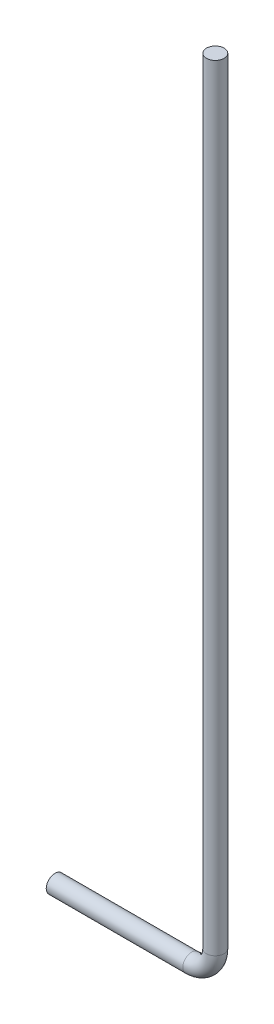
ISO-10303-21;
HEADER;
FILE_DESCRIPTION(('STEP AP214'),'2;1');
FILE_NAME('part.step','',(''),(''),'','','');
FILE_SCHEMA(('AUTOMOTIVE_DESIGN { 1 0 10303 214 1 1 1 1 }'));
ENDSEC;
DATA;
#1=APPLICATION_CONTEXT('core data for automotive mechanical design processes');
#2=APPLICATION_PROTOCOL_DEFINITION('international standard','automotive_design',2000,#1);
#3=PRODUCT_CONTEXT('',#1,'mechanical');
#4=PRODUCT('Part','Part','',(#3));
#5=PRODUCT_RELATED_PRODUCT_CATEGORY('part','',(#4));
#6=PRODUCT_DEFINITION_FORMATION('','',#4);
#7=PRODUCT_DEFINITION_CONTEXT('part definition',#1,'design');
#8=PRODUCT_DEFINITION('design','',#6,#7);
#9=PRODUCT_DEFINITION_SHAPE('','',#8);
#10=(LENGTH_UNIT() NAMED_UNIT(*) SI_UNIT(.MILLI.,.METRE.));
#11=(NAMED_UNIT(*) PLANE_ANGLE_UNIT() SI_UNIT($,.RADIAN.));
#12=(NAMED_UNIT(*) SI_UNIT($,.STERADIAN.) SOLID_ANGLE_UNIT());
#13=UNCERTAINTY_MEASURE_WITH_UNIT(LENGTH_MEASURE(1.E-05),#10,'distance_accuracy_value','');
#14=(GEOMETRIC_REPRESENTATION_CONTEXT(3) GLOBAL_UNCERTAINTY_ASSIGNED_CONTEXT((#13)) GLOBAL_UNIT_ASSIGNED_CONTEXT((#10,
#11,#12)) REPRESENTATION_CONTEXT('',''));
#15=CARTESIAN_POINT('',(0.,0.,0.));
#16=DIRECTION('',(0.,0.,1.));
#17=DIRECTION('',(1.,0.,0.));
#18=AXIS2_PLACEMENT_3D('',#15,#16,#17);
#19=CARTESIAN_POINT('',(0.,300.,0.));
#20=DIRECTION('',(0.,1.,0.));
#21=DIRECTION('',(0.,0.,1.));
#22=AXIS2_PLACEMENT_3D('',#19,#20,#21);
#23=PLANE('',#22);
#24=CARTESIAN_POINT('',(0.,300.,0.));
#25=DIRECTION('',(0.,1.,0.));
#26=DIRECTION('',(0.,0.,1.));
#27=AXIS2_PLACEMENT_3D('',#24,#25,#26);
#28=CIRCLE('',#27,4.);
#29=CARTESIAN_POINT('',(0.,300.,4.));
#30=VERTEX_POINT('',#29);
#31=EDGE_CURVE('E45',#30,#30,#28,.T.);
#32=ORIENTED_EDGE('',*,*,#31,.T.);
#33=EDGE_LOOP('',(#32));
#34=FACE_BOUND('',#33,.T.);
#35=ADVANCED_FACE('F33',(#34),#23,.T.);
#36=CARTESIAN_POINT('',(-72.4790484140234,-61.5156253658312,0.));
#37=DIRECTION('',(1.,0.,0.));
#38=DIRECTION('',(0.,0.,1.));
#39=AXIS2_PLACEMENT_3D('',#36,#37,#38);
#40=PLANE('',#39);
#41=CARTESIAN_POINT('',(-72.4790484140234,-61.5156253658312,0.));
#42=DIRECTION('',(1.,0.,0.));
#43=DIRECTION('',(0.,0.,1.));
#44=AXIS2_PLACEMENT_3D('',#41,#42,#43);
#45=CIRCLE('',#44,4.);
#46=CARTESIAN_POINT('',(-72.4790484140234,-61.5156253658312,4.));
#47=VERTEX_POINT('',#46);
#48=EDGE_CURVE('E11',#47,#47,#45,.T.);
#49=ORIENTED_EDGE('',*,*,#48,.F.);
#50=EDGE_LOOP('',(#49));
#51=FACE_BOUND('',#50,.T.);
#52=ADVANCED_FACE('F51',(#51),#40,.F.);
#53=CARTESIAN_POINT('',(0.,300.,0.));
#54=DIRECTION('',(0.,-1.,0.));
#55=DIRECTION('',(0.,0.,-1.));
#56=AXIS2_PLACEMENT_3D('',#53,#54,#55);
#57=CYLINDRICAL_SURFACE('',#56,4.);
#58=CARTESIAN_POINT('',(0.,-50.8,0.));
#59=DIRECTION('',(0.,1.,0.));
#60=DIRECTION('',(0.,0.,1.));
#61=AXIS2_PLACEMENT_3D('',#58,#59,#60);
#62=CIRCLE('',#61,4.);
#63=CARTESIAN_POINT('',(4.,-50.8,0.));
#64=VERTEX_POINT('',#63);
#65=EDGE_CURVE('E76',#64,#64,#62,.T.);
#66=ORIENTED_EDGE('',*,*,#65,.T.);
#67=EDGE_LOOP('',(#66));
#68=FACE_BOUND('',#67,.T.);
#69=ORIENTED_EDGE('',*,*,#31,.F.);
#70=EDGE_LOOP('',(#69));
#71=FACE_BOUND('',#70,.T.);
#72=ADVANCED_FACE('F53',(#68,#71),#57,.T.);
#73=CARTESIAN_POINT('',(-10.7156253658312,-50.8,0.));
#74=DIRECTION('',(0.,0.,-1.));
#75=DIRECTION('',(-1.,0.,0.));
#76=AXIS2_PLACEMENT_3D('',#73,#74,#75);
#77=TOROIDAL_SURFACE('',#76,10.7156253658312,4.);
#78=CARTESIAN_POINT('',(-10.7156253658311,-61.5156253658312,0.));
#79=DIRECTION('',(1.,0.,0.));
#80=DIRECTION('',(0.,0.,1.));
#81=AXIS2_PLACEMENT_3D('',#78,#79,#80);
#82=CIRCLE('',#81,4.);
#83=CARTESIAN_POINT('',(-10.7156253658311,-65.5156253658312,0.));
#84=VERTEX_POINT('',#83);
#85=EDGE_CURVE('E40',#84,#84,#82,.T.);
#86=CARTESIAN_POINT('',(-10.7156253658312,-50.8,0.));
#87=DIRECTION('',(0.,0.,-1.));
#88=DIRECTION('',(-1.,0.,0.));
#89=AXIS2_PLACEMENT_3D('',#86,#87,#88);
#90=CIRCLE('',#89,14.7156253658312);
#91=EDGE_CURVE('',#64,#84,#90,.T.);
#92=ORIENTED_EDGE('',*,*,#65,.F.);
#93=ORIENTED_EDGE('',*,*,#85,.T.);
#94=ORIENTED_EDGE('',*,*,#91,.T.);
#95=ORIENTED_EDGE('',*,*,#91,.F.);
#96=EDGE_LOOP('',(#92,#94,#93,#95));
#97=FACE_BOUND('',#96,.T.);
#98=ADVANCED_FACE('F58',(#97),#77,.T.);
#99=CARTESIAN_POINT('',(-10.7156253658311,-61.5156253658312,0.));
#100=DIRECTION('',(-1.,0.,0.));
#101=DIRECTION('',(0.,-1.,0.));
#102=AXIS2_PLACEMENT_3D('',#99,#100,#101);
#103=CYLINDRICAL_SURFACE('',#102,4.);
#104=ORIENTED_EDGE('',*,*,#48,.T.);
#105=EDGE_LOOP('',(#104));
#106=FACE_BOUND('',#105,.T.);
#107=ORIENTED_EDGE('',*,*,#85,.F.);
#108=EDGE_LOOP('',(#107));
#109=FACE_BOUND('',#108,.T.);
#110=ADVANCED_FACE('F48',(#106,#109),#103,.T.);
#111=CLOSED_SHELL('',(#35,#52,#72,#98,#110));
#112=MANIFOLD_SOLID_BREP('B2',#111);
#113=ADVANCED_BREP_SHAPE_REPRESENTATION('',(#18,#112),#14);
#114=SHAPE_DEFINITION_REPRESENTATION(#9,#113);
ENDSEC;
END-ISO-10303-21;
